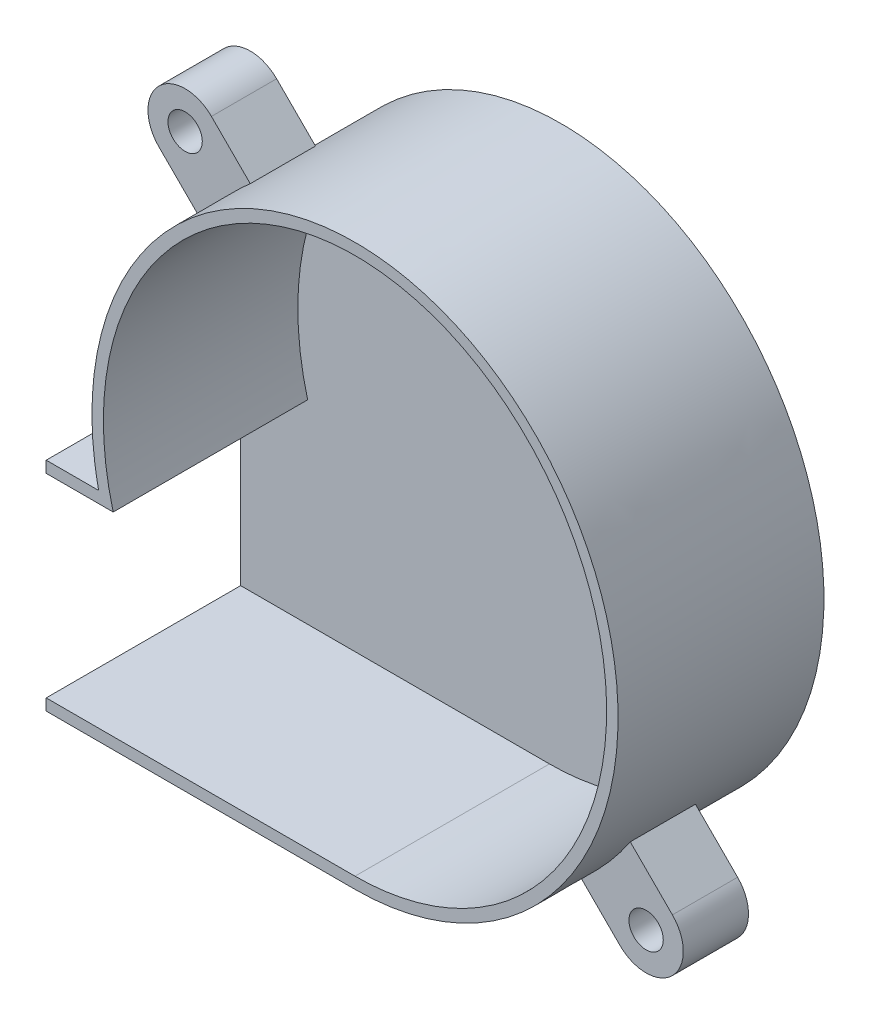
ISO-10303-21;
HEADER;
FILE_DESCRIPTION(('STEP AP214'),'2;1');
FILE_NAME('part.step','',(''),(''),'','','');
FILE_SCHEMA(('AUTOMOTIVE_DESIGN { 1 0 10303 214 1 1 1 1 }'));
ENDSEC;
DATA;
#1=APPLICATION_CONTEXT('core data for automotive mechanical design processes');
#2=APPLICATION_PROTOCOL_DEFINITION('international standard','automotive_design',2000,#1);
#3=PRODUCT_CONTEXT('',#1,'mechanical');
#4=PRODUCT('Part','Part','',(#3));
#5=PRODUCT_RELATED_PRODUCT_CATEGORY('part','',(#4));
#6=PRODUCT_DEFINITION_FORMATION('','',#4);
#7=PRODUCT_DEFINITION_CONTEXT('part definition',#1,'design');
#8=PRODUCT_DEFINITION('design','',#6,#7);
#9=PRODUCT_DEFINITION_SHAPE('','',#8);
#10=(LENGTH_UNIT() NAMED_UNIT(*) SI_UNIT(.MILLI.,.METRE.));
#11=(NAMED_UNIT(*) PLANE_ANGLE_UNIT() SI_UNIT($,.RADIAN.));
#12=(NAMED_UNIT(*) SI_UNIT($,.STERADIAN.) SOLID_ANGLE_UNIT());
#13=UNCERTAINTY_MEASURE_WITH_UNIT(LENGTH_MEASURE(1.E-05),#10,'distance_accuracy_value','');
#14=(GEOMETRIC_REPRESENTATION_CONTEXT(3) GLOBAL_UNCERTAINTY_ASSIGNED_CONTEXT((#13)) GLOBAL_UNIT_ASSIGNED_CONTEXT((#10,
#11,#12)) REPRESENTATION_CONTEXT('',''));
#15=CARTESIAN_POINT('',(0.,0.,0.));
#16=DIRECTION('',(0.,0.,1.));
#17=DIRECTION('',(1.,0.,0.));
#18=AXIS2_PLACEMENT_3D('',#15,#16,#17);
#19=CARTESIAN_POINT('',(0.,0.,1.));
#20=DIRECTION('',(0.,0.,1.));
#21=DIRECTION('',(0.,1.,0.));
#22=AXIS2_PLACEMENT_3D('',#19,#20,#21);
#23=ELLIPSE('',#22,24.5,23.);
#24=DIRECTION('',(0.,0.,-1.));
#25=VECTOR('',#24,1.);
#26=SURFACE_OF_LINEAR_EXTRUSION('',#23,#25);
#27=CARTESIAN_POINT('',(0.,0.,0.));
#28=DIRECTION('',(0.,0.,1.));
#29=DIRECTION('',(0.,1.,0.));
#30=AXIS2_PLACEMENT_3D('',#27,#28,#29);
#31=ELLIPSE('',#30,24.5,23.);
#32=CARTESIAN_POINT('',(0.,-24.5,0.));
#33=VERTEX_POINT('',#32);
#34=CARTESIAN_POINT('',(-22.4129581130781,-5.5,0.));
#35=VERTEX_POINT('',#34);
#36=EDGE_CURVE('E263',#33,#35,#31,.T.);
#37=ORIENTED_EDGE('',*,*,#36,.T.);
#38=DIRECTION('',(0.,0.,-1.));
#39=VECTOR('',#38,1.);
#40=CARTESIAN_POINT('',(-22.4129581130781,-5.5,1.));
#41=LINE('',#40,#39);
#42=CARTESIAN_POINT('',(-22.4129581130781,-5.5,18.));
#43=VERTEX_POINT('',#42);
#44=EDGE_CURVE('E42',#43,#35,#41,.T.);
#45=ORIENTED_EDGE('',*,*,#44,.F.);
#46=CARTESIAN_POINT('',(0.,0.,18.));
#47=DIRECTION('',(0.,0.,1.));
#48=DIRECTION('',(0.,1.,0.));
#49=AXIS2_PLACEMENT_3D('',#46,#47,#48);
#50=ELLIPSE('',#49,24.5,23.);
#51=CARTESIAN_POINT('',(0.,-24.5,18.));
#52=VERTEX_POINT('',#51);
#53=EDGE_CURVE('E291',#52,#43,#50,.T.);
#54=ORIENTED_EDGE('',*,*,#53,.F.);
#55=DIRECTION('',(0.,0.,-1.));
#56=VECTOR('',#55,1.);
#57=CARTESIAN_POINT('',(0.,-24.5,1.));
#58=LINE('',#57,#56);
#59=EDGE_CURVE('E11',#52,#33,#58,.T.);
#60=ORIENTED_EDGE('',*,*,#59,.T.);
#61=EDGE_LOOP('',(#37,#45,#54,#60));
#62=FACE_BOUND('',#61,.T.);
#63=CARTESIAN_POINT('',(0.,0.,12.7));
#64=DIRECTION('',(0.,0.,-1.));
#65=DIRECTION('',(0.,1.,0.));
#66=AXIS2_PLACEMENT_3D('',#63,#64,#65);
#67=ELLIPSE('',#66,24.5,23.);
#68=CARTESIAN_POINT('',(18.7641912023517,-14.1679971246392,12.7));
#69=VERTEX_POINT('',#68);
#70=CARTESIAN_POINT('',(14.4579938729562,-19.0541879506688,12.7));
#71=VERTEX_POINT('',#70);
#72=EDGE_CURVE('E186',#69,#71,#67,.T.);
#73=ORIENTED_EDGE('',*,*,#72,.F.);
#74=DIRECTION('',(0.,0.,-1.));
#75=VECTOR('',#74,1.);
#76=CARTESIAN_POINT('',(18.7641912023517,-14.1679971246392,12.7));
#77=LINE('',#76,#75);
#78=CARTESIAN_POINT('',(18.7641912023517,-14.1679971246392,7.));
#79=VERTEX_POINT('',#78);
#80=EDGE_CURVE('E205',#69,#79,#77,.T.);
#81=ORIENTED_EDGE('',*,*,#80,.T.);
#82=CARTESIAN_POINT('',(0.,0.,7.));
#83=DIRECTION('',(0.,0.,-1.));
#84=DIRECTION('',(0.,1.,0.));
#85=AXIS2_PLACEMENT_3D('',#82,#83,#84);
#86=ELLIPSE('',#85,24.5,23.);
#87=CARTESIAN_POINT('',(14.4579938729562,-19.0541879506688,7.));
#88=VERTEX_POINT('',#87);
#89=EDGE_CURVE('E197',#79,#88,#86,.T.);
#90=ORIENTED_EDGE('',*,*,#89,.T.);
#91=DIRECTION('',(0.,0.,-1.));
#92=VECTOR('',#91,1.);
#93=CARTESIAN_POINT('',(14.4579938729562,-19.0541879506688,12.7));
#94=LINE('',#93,#92);
#95=EDGE_CURVE('E202',#71,#88,#94,.T.);
#96=ORIENTED_EDGE('',*,*,#95,.F.);
#97=EDGE_LOOP('',(#73,#81,#90,#96));
#98=FACE_BOUND('',#97,.T.);
#99=DIRECTION('',(0.,0.,-1.));
#100=VECTOR('',#99,1.);
#101=CARTESIAN_POINT('',(-18.7641912023517,14.1679971246392,12.7));
#102=LINE('',#101,#100);
#103=CARTESIAN_POINT('',(-18.7641912023517,14.1679971246392,12.7));
#104=VERTEX_POINT('',#103);
#105=CARTESIAN_POINT('',(-18.7641912023517,14.1679971246392,7.));
#106=VERTEX_POINT('',#105);
#107=EDGE_CURVE('E55',#104,#106,#102,.T.);
#108=ORIENTED_EDGE('',*,*,#107,.T.);
#109=CARTESIAN_POINT('',(0.,0.,7.));
#110=DIRECTION('',(0.,0.,-1.));
#111=DIRECTION('',(0.,1.,0.));
#112=AXIS2_PLACEMENT_3D('',#109,#110,#111);
#113=ELLIPSE('',#112,24.5,23.);
#114=CARTESIAN_POINT('',(-14.4579938729562,19.0541879506688,7.));
#115=VERTEX_POINT('',#114);
#116=EDGE_CURVE('E548',#106,#115,#113,.T.);
#117=ORIENTED_EDGE('',*,*,#116,.T.);
#118=DIRECTION('',(0.,0.,-1.));
#119=VECTOR('',#118,1.);
#120=CARTESIAN_POINT('',(-14.4579938729562,19.0541879506688,12.7));
#121=LINE('',#120,#119);
#122=CARTESIAN_POINT('',(-14.4579938729562,19.0541879506688,12.7));
#123=VERTEX_POINT('',#122);
#124=EDGE_CURVE('E172',#123,#115,#121,.T.);
#125=ORIENTED_EDGE('',*,*,#124,.F.);
#126=CARTESIAN_POINT('',(0.,0.,12.7));
#127=DIRECTION('',(0.,0.,-1.));
#128=DIRECTION('',(0.,1.,0.));
#129=AXIS2_PLACEMENT_3D('',#126,#127,#128);
#130=ELLIPSE('',#129,24.5,23.);
#131=EDGE_CURVE('E50',#104,#123,#130,.T.);
#132=ORIENTED_EDGE('',*,*,#131,.F.);
#133=EDGE_LOOP('',(#108,#117,#125,#132));
#134=FACE_BOUND('',#133,.T.);
#135=ADVANCED_FACE('F33',(#62,#98,#134),#26,.F.);
#136=CARTESIAN_POINT('',(0.,0.,1.));
#137=DIRECTION('',(0.,0.,1.));
#138=DIRECTION('',(1.,0.,0.));
#139=AXIS2_PLACEMENT_3D('',#136,#137,#138);
#140=PLANE('',#139);
#141=CARTESIAN_POINT('',(-21.1415560322634,-6.5,1.));
#142=CARTESIAN_POINT('',(-21.7759040850454,-4.14616663162075,1.));
#143=CARTESIAN_POINT('',(-22.3500460661726,0.776913351469055,1.));
#144=CARTESIAN_POINT('',(-21.0411485837453,8.08553426296956,1.));
#145=CARTESIAN_POINT('',(-17.6937405646126,14.6032514803996,1.));
#146=CARTESIAN_POINT('',(-12.6420113209987,19.6989015023427,1.));
#147=CARTESIAN_POINT('',(-6.38255061293039,22.8884215040737,1.));
#148=CARTESIAN_POINT('',(0.481967818505515,23.8764200203381,1.));
#149=CARTESIAN_POINT('',(7.30093031096783,22.5731099930776,1.));
#150=CARTESIAN_POINT('',(13.4271662597007,19.097124392934,1.));
#151=CARTESIAN_POINT('',(18.2691214581346,13.7715197027639,1.));
#152=CARTESIAN_POINT('',(21.3495837922645,7.10381393233231,1.));
#153=CARTESIAN_POINT('',(22.3605885719932,-0.259019098050411,1.));
#154=CARTESIAN_POINT('',(21.2003019493631,-7.59647296507907,1.));
#155=CARTESIAN_POINT('',(17.9857877784713,-14.1907372017755,1.));
#156=CARTESIAN_POINT('',(13.0370136266574,-19.4025638833507,1.));
#157=CARTESIAN_POINT('',(6.84551830863374,-22.7360633797071,1.));
#158=CARTESIAN_POINT('',(2.27634490260257,-23.5,1.));
#159=CARTESIAN_POINT('',(0.,-23.5,1.));
#160=B_SPLINE_CURVE_WITH_KNOTS('',3,(#141,#142,#143,#144,#145,#146,#147,#148,#149,#150,#151,
#152,#153,#154,#155,#156,#157,#158,#159),.UNSPECIFIED.,.F.,.F.,(4,1,1,1,1,1,1,1,1,1,1,1,1,1,1,1,
4),(-3.14159265358979,-2.82959621533012,-2.51759977707045,-2.20560333881077,-1.8936069005511,
-1.58161046229143,-1.26961402403176,-0.957617585772083,-0.64562114751241,-0.333624709252737,
-0.0216282709930642,0.290368167266609,0.602364605526281,0.914361043785954,1.22635748204563,
1.5383539203053,1.85035035856497),.UNSPECIFIED.);
#161=CARTESIAN_POINT('',(0.,-23.5,1.));
#162=VERTEX_POINT('',#161);
#163=CARTESIAN_POINT('',(-21.1415560322634,-6.5,1.));
#164=VERTEX_POINT('',#163);
#165=EDGE_CURVE('E311',#162,#164,#160,.F.);
#166=ORIENTED_EDGE('',*,*,#165,.T.);
#167=DIRECTION('',(-1.,0.,0.));
#168=VECTOR('',#167,1.);
#169=CARTESIAN_POINT('',(0.,-6.49999999999998,1.));
#170=LINE('',#169,#168);
#171=CARTESIAN_POINT('',(-27.,-6.50000000000001,1.));
#172=VERTEX_POINT('',#171);
#173=EDGE_CURVE('E258',#164,#172,#170,.T.);
#174=ORIENTED_EDGE('',*,*,#173,.T.);
#175=DIRECTION('',(0.,1.,0.));
#176=VECTOR('',#175,1.);
#177=CARTESIAN_POINT('',(-27.,-24.5,1.));
#178=LINE('',#177,#176);
#179=CARTESIAN_POINT('',(-27.,-23.5,1.));
#180=VERTEX_POINT('',#179);
#181=EDGE_CURVE('E252',#180,#172,#178,.T.);
#182=ORIENTED_EDGE('',*,*,#181,.F.);
#183=DIRECTION('',(1.,0.,0.));
#184=VECTOR('',#183,1.);
#185=CARTESIAN_POINT('',(0.,-23.5,1.));
#186=LINE('',#185,#184);
#187=EDGE_CURVE('E308',#180,#162,#186,.T.);
#188=ORIENTED_EDGE('',*,*,#187,.T.);
#189=EDGE_LOOP('',(#166,#174,#182,#188));
#190=FACE_BOUND('',#189,.T.);
#191=ADVANCED_FACE('F236',(#190),#140,.T.);
#192=CARTESIAN_POINT('',(0.,-24.5,1.));
#193=DIRECTION('',(0.,-1.,0.));
#194=DIRECTION('',(1.,0.,0.));
#195=AXIS2_PLACEMENT_3D('',#192,#193,#194);
#196=PLANE('',#195);
#197=DIRECTION('',(-1.,0.,0.));
#198=VECTOR('',#197,1.);
#199=CARTESIAN_POINT('',(0.,-24.5,0.));
#200=LINE('',#199,#198);
#201=CARTESIAN_POINT('',(-27.,-24.5,0.));
#202=VERTEX_POINT('',#201);
#203=EDGE_CURVE('E254',#33,#202,#200,.T.);
#204=ORIENTED_EDGE('',*,*,#203,.F.);
#205=ORIENTED_EDGE('',*,*,#59,.F.);
#206=DIRECTION('',(-1.,0.,0.));
#207=VECTOR('',#206,1.);
#208=CARTESIAN_POINT('',(0.,-24.5,18.));
#209=LINE('',#208,#207);
#210=CARTESIAN_POINT('',(-27.,-24.5,18.));
#211=VERTEX_POINT('',#210);
#212=EDGE_CURVE('E295',#52,#211,#209,.T.);
#213=ORIENTED_EDGE('',*,*,#212,.T.);
#214=DIRECTION('',(0.,0.,-1.));
#215=VECTOR('',#214,1.);
#216=CARTESIAN_POINT('',(-27.,-24.5,1.));
#217=LINE('',#216,#215);
#218=EDGE_CURVE('E269',#211,#202,#217,.T.);
#219=ORIENTED_EDGE('',*,*,#218,.T.);
#220=EDGE_LOOP('',(#204,#205,#213,#219));
#221=FACE_BOUND('',#220,.T.);
#222=ADVANCED_FACE('F35',(#221),#196,.T.);
#223=CARTESIAN_POINT('',(-27.,-5.50000000000001,1.));
#224=DIRECTION('',(0.,1.,0.));
#225=DIRECTION('',(-1.,0.,0.));
#226=AXIS2_PLACEMENT_3D('',#223,#224,#225);
#227=PLANE('',#226);
#228=DIRECTION('',(1.,0.,0.));
#229=VECTOR('',#228,1.);
#230=CARTESIAN_POINT('',(-27.,-5.50000000000001,0.));
#231=LINE('',#230,#229);
#232=CARTESIAN_POINT('',(-27.,-5.50000000000001,0.));
#233=VERTEX_POINT('',#232);
#234=EDGE_CURVE('E260',#233,#35,#231,.T.);
#235=ORIENTED_EDGE('',*,*,#234,.F.);
#236=DIRECTION('',(0.,0.,-1.));
#237=VECTOR('',#236,1.);
#238=CARTESIAN_POINT('',(-27.,-5.50000000000001,1.));
#239=LINE('',#238,#237);
#240=CARTESIAN_POINT('',(-27.,-5.50000000000001,18.));
#241=VERTEX_POINT('',#240);
#242=EDGE_CURVE('E266',#241,#233,#239,.T.);
#243=ORIENTED_EDGE('',*,*,#242,.F.);
#244=DIRECTION('',(1.,0.,0.));
#245=VECTOR('',#244,1.);
#246=CARTESIAN_POINT('',(0.,-5.49999999999999,18.));
#247=LINE('',#246,#245);
#248=EDGE_CURVE('E276',#241,#43,#247,.T.);
#249=ORIENTED_EDGE('',*,*,#248,.T.);
#250=ORIENTED_EDGE('',*,*,#44,.T.);
#251=EDGE_LOOP('',(#235,#243,#249,#250));
#252=FACE_BOUND('',#251,.T.);
#253=ADVANCED_FACE('F248',(#252),#227,.T.);
#254=CARTESIAN_POINT('',(-27.,-24.5,1.));
#255=DIRECTION('',(-1.,0.,0.));
#256=DIRECTION('',(0.,0.,1.));
#257=AXIS2_PLACEMENT_3D('',#254,#255,#256);
#258=PLANE('',#257);
#259=DIRECTION('',(0.,0.,-1.));
#260=VECTOR('',#259,1.);
#261=CARTESIAN_POINT('',(-27.,-23.5,18.));
#262=LINE('',#261,#260);
#263=CARTESIAN_POINT('',(-27.,-23.5,18.));
#264=VERTEX_POINT('',#263);
#265=EDGE_CURVE('E300',#264,#180,#262,.T.);
#266=ORIENTED_EDGE('',*,*,#265,.T.);
#267=ORIENTED_EDGE('',*,*,#181,.T.);
#268=DIRECTION('',(0.,0.,-1.));
#269=VECTOR('',#268,1.);
#270=CARTESIAN_POINT('',(-27.,-6.50000000000001,18.));
#271=LINE('',#270,#269);
#272=CARTESIAN_POINT('',(-27.,-6.50000000000001,18.));
#273=VERTEX_POINT('',#272);
#274=EDGE_CURVE('E293',#273,#172,#271,.T.);
#275=ORIENTED_EDGE('',*,*,#274,.F.);
#276=DIRECTION('',(0.,1.,0.));
#277=VECTOR('',#276,1.);
#278=CARTESIAN_POINT('',(-27.,0.,18.));
#279=LINE('',#278,#277);
#280=EDGE_CURVE('E287',#273,#241,#279,.T.);
#281=ORIENTED_EDGE('',*,*,#280,.T.);
#282=ORIENTED_EDGE('',*,*,#242,.T.);
#283=DIRECTION('',(0.,1.,0.));
#284=VECTOR('',#283,1.);
#285=CARTESIAN_POINT('',(-27.,-24.5,0.));
#286=LINE('',#285,#284);
#287=EDGE_CURVE('E257',#202,#233,#286,.T.);
#288=ORIENTED_EDGE('',*,*,#287,.F.);
#289=ORIENTED_EDGE('',*,*,#218,.F.);
#290=EDGE_CURVE('E294',#211,#264,#279,.T.);
#291=ORIENTED_EDGE('',*,*,#290,.T.);
#292=EDGE_LOOP('',(#266,#267,#275,#281,#282,#288,#289,#291));
#293=FACE_BOUND('',#292,.T.);
#294=ADVANCED_FACE('F242',(#293),#258,.T.);
#295=CARTESIAN_POINT('',(0.,0.,0.));
#296=DIRECTION('',(0.,0.,1.));
#297=DIRECTION('',(1.,0.,0.));
#298=AXIS2_PLACEMENT_3D('',#295,#296,#297);
#299=PLANE('',#298);
#300=ORIENTED_EDGE('',*,*,#287,.T.);
#301=ORIENTED_EDGE('',*,*,#234,.T.);
#302=ORIENTED_EDGE('',*,*,#36,.F.);
#303=ORIENTED_EDGE('',*,*,#203,.T.);
#304=EDGE_LOOP('',(#300,#301,#302,#303));
#305=FACE_BOUND('',#304,.T.);
#306=ADVANCED_FACE('F234',(#305),#299,.F.);
#307=CARTESIAN_POINT('',(0.,-6.49999999999998,18.));
#308=DIRECTION('',(0.,1.,0.));
#309=DIRECTION('',(-1.,0.,0.));
#310=AXIS2_PLACEMENT_3D('',#307,#308,#309);
#311=PLANE('',#310);
#312=ORIENTED_EDGE('',*,*,#173,.F.);
#313=DIRECTION('',(0.,0.,-1.));
#314=VECTOR('',#313,1.);
#315=CARTESIAN_POINT('',(-21.1415560322634,-6.5,18.));
#316=LINE('',#315,#314);
#317=CARTESIAN_POINT('',(-21.1415560322634,-6.5,18.));
#318=VERTEX_POINT('',#317);
#319=EDGE_CURVE('E305',#318,#164,#316,.T.);
#320=ORIENTED_EDGE('',*,*,#319,.F.);
#321=DIRECTION('',(1.,0.,0.));
#322=VECTOR('',#321,1.);
#323=CARTESIAN_POINT('',(0.,-6.49999999999998,18.));
#324=LINE('',#323,#322);
#325=EDGE_CURVE('E210',#273,#318,#324,.T.);
#326=ORIENTED_EDGE('',*,*,#325,.F.);
#327=ORIENTED_EDGE('',*,*,#274,.T.);
#328=EDGE_LOOP('',(#312,#320,#326,#327));
#329=FACE_BOUND('',#328,.T.);
#330=ADVANCED_FACE('F229',(#329),#311,.F.);
#331=CARTESIAN_POINT('',(-21.1415560322634,-6.5,18.));
#332=CARTESIAN_POINT('',(-21.7759040850454,-4.14616663162075,18.));
#333=CARTESIAN_POINT('',(-22.3500460661726,0.776913351469055,18.));
#334=CARTESIAN_POINT('',(-21.0411485837453,8.08553426296956,18.));
#335=CARTESIAN_POINT('',(-17.6937405646126,14.6032514803996,18.));
#336=CARTESIAN_POINT('',(-12.6420113209987,19.6989015023427,18.));
#337=CARTESIAN_POINT('',(-6.38255061293039,22.8884215040737,18.));
#338=CARTESIAN_POINT('',(0.481967818505515,23.8764200203381,18.));
#339=CARTESIAN_POINT('',(7.30093031096783,22.5731099930776,18.));
#340=CARTESIAN_POINT('',(13.4271662597007,19.097124392934,18.));
#341=CARTESIAN_POINT('',(18.2691214581346,13.7715197027639,18.));
#342=CARTESIAN_POINT('',(21.3495837922645,7.10381393233231,18.));
#343=CARTESIAN_POINT('',(22.3605885719932,-0.259019098050411,18.));
#344=CARTESIAN_POINT('',(21.2003019493631,-7.59647296507907,18.));
#345=CARTESIAN_POINT('',(17.9857877784713,-14.1907372017755,18.));
#346=CARTESIAN_POINT('',(13.0370136266574,-19.4025638833507,18.));
#347=CARTESIAN_POINT('',(6.84551830863374,-22.7360633797071,18.));
#348=CARTESIAN_POINT('',(2.27634490260257,-23.5,18.));
#349=CARTESIAN_POINT('',(0.,-23.5,18.));
#350=B_SPLINE_CURVE_WITH_KNOTS('',3,(#331,#332,#333,#334,#335,#336,#337,#338,#339,#340,#341,
#342,#343,#344,#345,#346,#347,#348,#349),.UNSPECIFIED.,.F.,.F.,(4,1,1,1,1,1,1,1,1,1,1,1,1,1,1,1,
4),(-3.14159265358979,-2.82959621533012,-2.51759977707045,-2.20560333881077,-1.8936069005511,
-1.58161046229143,-1.26961402403176,-0.957617585772083,-0.64562114751241,-0.333624709252737,
-0.0216282709930642,0.290368167266609,0.602364605526281,0.914361043785954,1.22635748204563,
1.5383539203053,1.85035035856497),.UNSPECIFIED.);
#351=DIRECTION('',(0.,0.,-1.));
#352=VECTOR('',#351,1.);
#353=SURFACE_OF_LINEAR_EXTRUSION('',#350,#352);
#354=ORIENTED_EDGE('',*,*,#165,.F.);
#355=DIRECTION('',(0.,0.,-1.));
#356=VECTOR('',#355,1.);
#357=CARTESIAN_POINT('',(0.,-23.5,18.));
#358=LINE('',#357,#356);
#359=CARTESIAN_POINT('',(0.,-23.5,18.));
#360=VERTEX_POINT('',#359);
#361=EDGE_CURVE('E302',#360,#162,#358,.T.);
#362=ORIENTED_EDGE('',*,*,#361,.F.);
#363=EDGE_CURVE('E213',#318,#360,#350,.T.);
#364=ORIENTED_EDGE('',*,*,#363,.F.);
#365=ORIENTED_EDGE('',*,*,#319,.T.);
#366=EDGE_LOOP('',(#354,#362,#364,#365));
#367=FACE_BOUND('',#366,.T.);
#368=ADVANCED_FACE('F224',(#367),#353,.F.);
#369=CARTESIAN_POINT('',(0.,-23.5,18.));
#370=DIRECTION('',(0.,-1.,0.));
#371=DIRECTION('',(0.,0.,-1.));
#372=AXIS2_PLACEMENT_3D('',#369,#370,#371);
#373=PLANE('',#372);
#374=ORIENTED_EDGE('',*,*,#187,.F.);
#375=ORIENTED_EDGE('',*,*,#265,.F.);
#376=DIRECTION('',(-1.,0.,0.));
#377=VECTOR('',#376,1.);
#378=CARTESIAN_POINT('',(0.,-23.5,18.));
#379=LINE('',#378,#377);
#380=EDGE_CURVE('E218',#360,#264,#379,.T.);
#381=ORIENTED_EDGE('',*,*,#380,.F.);
#382=ORIENTED_EDGE('',*,*,#361,.T.);
#383=EDGE_LOOP('',(#374,#375,#381,#382));
#384=FACE_BOUND('',#383,.T.);
#385=ADVANCED_FACE('F228',(#384),#373,.F.);
#386=CARTESIAN_POINT('',(0.,0.,18.));
#387=DIRECTION('',(0.,0.,1.));
#388=DIRECTION('',(1.,0.,0.));
#389=AXIS2_PLACEMENT_3D('',#386,#387,#388);
#390=PLANE('',#389);
#391=ORIENTED_EDGE('',*,*,#325,.T.);
#392=ORIENTED_EDGE('',*,*,#363,.T.);
#393=ORIENTED_EDGE('',*,*,#380,.T.);
#394=ORIENTED_EDGE('',*,*,#290,.F.);
#395=ORIENTED_EDGE('',*,*,#212,.F.);
#396=ORIENTED_EDGE('',*,*,#53,.T.);
#397=ORIENTED_EDGE('',*,*,#248,.F.);
#398=ORIENTED_EDGE('',*,*,#280,.F.);
#399=EDGE_LOOP('',(#391,#392,#393,#394,#395,#396,#397,#398));
#400=FACE_BOUND('',#399,.T.);
#401=ADVANCED_FACE('F289',(#400),#390,.T.);
#402=CARTESIAN_POINT('',(0.,0.,12.7));
#403=DIRECTION('',(0.,0.,1.));
#404=DIRECTION('',(1.,0.,0.));
#405=AXIS2_PLACEMENT_3D('',#402,#403,#404);
#406=PLANE('',#405);
#407=CARTESIAN_POINT('',(20.1525432638166,-20.1525432638166,12.7));
#408=DIRECTION('',(0.,0.,1.));
#409=DIRECTION('',(1.,0.,0.));
#410=AXIS2_PLACEMENT_3D('',#407,#408,#409);
#411=CIRCLE('',#410,3.25);
#412=CARTESIAN_POINT('',(17.8544462249603,-22.4506403026729,12.7));
#413=VERTEX_POINT('',#412);
#414=CARTESIAN_POINT('',(22.4506403026729,-17.8544462249603,12.7));
#415=VERTEX_POINT('',#414);
#416=EDGE_CURVE('E179',#413,#415,#411,.T.);
#417=ORIENTED_EDGE('',*,*,#416,.T.);
#418=DIRECTION('',(-0.707106781186547,0.707106781186549,0.));
#419=VECTOR('',#418,1.);
#420=CARTESIAN_POINT('',(22.4506403026729,-17.8544462249603,12.7));
#421=LINE('',#420,#419);
#422=EDGE_CURVE('E182',#415,#69,#421,.T.);
#423=ORIENTED_EDGE('',*,*,#422,.T.);
#424=ORIENTED_EDGE('',*,*,#72,.T.);
#425=DIRECTION('',(0.707106781186546,-0.707106781186549,0.));
#426=VECTOR('',#425,1.);
#427=CARTESIAN_POINT('',(17.8544462249603,-22.4506403026729,12.7));
#428=LINE('',#427,#426);
#429=EDGE_CURVE('E189',#71,#413,#428,.T.);
#430=ORIENTED_EDGE('',*,*,#429,.T.);
#431=EDGE_LOOP('',(#417,#423,#424,#430));
#432=FACE_BOUND('',#431,.T.);
#433=CARTESIAN_POINT('',(20.1525432638166,-20.1525432638166,12.7));
#434=DIRECTION('',(0.,0.,1.));
#435=DIRECTION('',(1.,0.,0.));
#436=AXIS2_PLACEMENT_3D('',#433,#434,#435);
#437=CIRCLE('',#436,1.5);
#438=CARTESIAN_POINT('',(21.6525432638166,-20.1525432638166,12.7));
#439=VERTEX_POINT('',#438);
#440=EDGE_CURVE('E170',#439,#439,#437,.T.);
#441=ORIENTED_EDGE('',*,*,#440,.F.);
#442=EDGE_LOOP('',(#441));
#443=FACE_BOUND('',#442,.T.);
#444=ADVANCED_FACE('F363',(#432,#443),#406,.T.);
#445=CARTESIAN_POINT('',(0.,0.,7.));
#446=DIRECTION('',(0.,0.,1.));
#447=DIRECTION('',(1.,0.,0.));
#448=AXIS2_PLACEMENT_3D('',#445,#446,#447);
#449=PLANE('',#448);
#450=CARTESIAN_POINT('',(20.1525432638166,-20.1525432638166,7.));
#451=DIRECTION('',(0.,0.,1.));
#452=DIRECTION('',(1.,0.,0.));
#453=AXIS2_PLACEMENT_3D('',#450,#451,#452);
#454=CIRCLE('',#453,3.25);
#455=CARTESIAN_POINT('',(17.8544462249603,-22.4506403026729,7.));
#456=VERTEX_POINT('',#455);
#457=CARTESIAN_POINT('',(22.4506403026729,-17.8544462249603,7.));
#458=VERTEX_POINT('',#457);
#459=EDGE_CURVE('E177',#456,#458,#454,.T.);
#460=ORIENTED_EDGE('',*,*,#459,.F.);
#461=DIRECTION('',(0.707106781186546,-0.707106781186549,0.));
#462=VECTOR('',#461,1.);
#463=CARTESIAN_POINT('',(17.8544462249603,-22.4506403026729,7.));
#464=LINE('',#463,#462);
#465=EDGE_CURVE('E183',#88,#456,#464,.T.);
#466=ORIENTED_EDGE('',*,*,#465,.F.);
#467=ORIENTED_EDGE('',*,*,#89,.F.);
#468=DIRECTION('',(-0.707106781186547,0.707106781186549,0.));
#469=VECTOR('',#468,1.);
#470=CARTESIAN_POINT('',(22.4506403026729,-17.8544462249603,7.));
#471=LINE('',#470,#469);
#472=EDGE_CURVE('E194',#458,#79,#471,.T.);
#473=ORIENTED_EDGE('',*,*,#472,.F.);
#474=EDGE_LOOP('',(#460,#466,#467,#473));
#475=FACE_BOUND('',#474,.T.);
#476=CARTESIAN_POINT('',(20.1525432638166,-20.1525432638166,7.));
#477=DIRECTION('',(0.,0.,1.));
#478=DIRECTION('',(1.,0.,0.));
#479=AXIS2_PLACEMENT_3D('',#476,#477,#478);
#480=CIRCLE('',#479,1.5);
#481=CARTESIAN_POINT('',(21.6525432638166,-20.1525432638166,7.));
#482=VERTEX_POINT('',#481);
#483=EDGE_CURVE('E167',#482,#482,#480,.T.);
#484=ORIENTED_EDGE('',*,*,#483,.T.);
#485=EDGE_LOOP('',(#484));
#486=FACE_BOUND('',#485,.T.);
#487=ADVANCED_FACE('F370',(#475,#486),#449,.F.);
#488=CARTESIAN_POINT('',(20.1525432638166,-20.1525432638166,12.7));
#489=DIRECTION('',(0.,0.,-1.));
#490=DIRECTION('',(-1.,0.,0.));
#491=AXIS2_PLACEMENT_3D('',#488,#489,#490);
#492=CYLINDRICAL_SURFACE('',#491,3.25);
#493=ORIENTED_EDGE('',*,*,#459,.T.);
#494=DIRECTION('',(0.,0.,-1.));
#495=VECTOR('',#494,1.);
#496=CARTESIAN_POINT('',(22.4506403026729,-17.8544462249603,12.7));
#497=LINE('',#496,#495);
#498=EDGE_CURVE('E207',#415,#458,#497,.T.);
#499=ORIENTED_EDGE('',*,*,#498,.F.);
#500=ORIENTED_EDGE('',*,*,#416,.F.);
#501=DIRECTION('',(0.,0.,-1.));
#502=VECTOR('',#501,1.);
#503=CARTESIAN_POINT('',(17.8544462249603,-22.4506403026729,12.7));
#504=LINE('',#503,#502);
#505=EDGE_CURVE('E191',#413,#456,#504,.T.);
#506=ORIENTED_EDGE('',*,*,#505,.T.);
#507=EDGE_LOOP('',(#493,#499,#500,#506));
#508=FACE_BOUND('',#507,.T.);
#509=ADVANCED_FACE('F378',(#508),#492,.T.);
#510=CARTESIAN_POINT('',(22.4506403026729,-17.8544462249603,12.7));
#511=DIRECTION('',(-0.707106781186548,-0.707106781186546,0.));
#512=DIRECTION('',(0.707106781186547,-0.707106781186549,0.));
#513=AXIS2_PLACEMENT_3D('',#510,#511,#512);
#514=PLANE('',#513);
#515=ORIENTED_EDGE('',*,*,#472,.T.);
#516=ORIENTED_EDGE('',*,*,#80,.F.);
#517=ORIENTED_EDGE('',*,*,#422,.F.);
#518=ORIENTED_EDGE('',*,*,#498,.T.);
#519=EDGE_LOOP('',(#515,#516,#517,#518));
#520=FACE_BOUND('',#519,.T.);
#521=ADVANCED_FACE('F386',(#520),#514,.F.);
#522=CARTESIAN_POINT('',(17.8544462249603,-22.4506403026729,12.7));
#523=DIRECTION('',(0.707106781186548,0.707106781186546,0.));
#524=DIRECTION('',(-0.707106781186546,0.707106781186549,0.));
#525=AXIS2_PLACEMENT_3D('',#522,#523,#524);
#526=PLANE('',#525);
#527=ORIENTED_EDGE('',*,*,#465,.T.);
#528=ORIENTED_EDGE('',*,*,#505,.F.);
#529=ORIENTED_EDGE('',*,*,#429,.F.);
#530=ORIENTED_EDGE('',*,*,#95,.T.);
#531=EDGE_LOOP('',(#527,#528,#529,#530));
#532=FACE_BOUND('',#531,.T.);
#533=ADVANCED_FACE('F394',(#532),#526,.F.);
#534=CARTESIAN_POINT('',(20.1525432638166,-20.1525432638166,12.7));
#535=DIRECTION('',(0.,0.,-1.));
#536=DIRECTION('',(-1.,0.,0.));
#537=AXIS2_PLACEMENT_3D('',#534,#535,#536);
#538=CYLINDRICAL_SURFACE('',#537,1.5);
#539=ORIENTED_EDGE('',*,*,#440,.T.);
#540=EDGE_LOOP('',(#539));
#541=FACE_BOUND('',#540,.T.);
#542=ORIENTED_EDGE('',*,*,#483,.F.);
#543=EDGE_LOOP('',(#542));
#544=FACE_BOUND('',#543,.T.);
#545=ADVANCED_FACE('F402',(#541,#544),#538,.F.);
#546=CARTESIAN_POINT('',(0.,0.,12.7));
#547=DIRECTION('',(0.,0.,1.));
#548=DIRECTION('',(1.,0.,0.));
#549=AXIS2_PLACEMENT_3D('',#546,#547,#548);
#550=PLANE('',#549);
#551=CARTESIAN_POINT('',(-20.1525432638166,20.1525432638166,12.7));
#552=DIRECTION('',(0.,0.,1.));
#553=DIRECTION('',(1.,0.,0.));
#554=AXIS2_PLACEMENT_3D('',#551,#552,#553);
#555=CIRCLE('',#554,3.24999999999999);
#556=CARTESIAN_POINT('',(-17.8544462249603,22.4506403026729,12.7));
#557=VERTEX_POINT('',#556);
#558=CARTESIAN_POINT('',(-22.4506403026728,17.8544462249604,12.7));
#559=VERTEX_POINT('',#558);
#560=EDGE_CURVE('E152',#557,#559,#555,.T.);
#561=ORIENTED_EDGE('',*,*,#560,.T.);
#562=DIRECTION('',(0.707106781186547,-0.707106781186548,0.));
#563=VECTOR('',#562,1.);
#564=CARTESIAN_POINT('',(-18.7641912023517,14.1679971246392,12.7));
#565=LINE('',#564,#563);
#566=EDGE_CURVE('E145',#559,#104,#565,.T.);
#567=ORIENTED_EDGE('',*,*,#566,.T.);
#568=ORIENTED_EDGE('',*,*,#131,.T.);
#569=DIRECTION('',(-0.707106781186546,0.707106781186549,0.));
#570=VECTOR('',#569,1.);
#571=CARTESIAN_POINT('',(-14.4579938729562,19.0541879506688,12.7));
#572=LINE('',#571,#570);
#573=EDGE_CURVE('E158',#123,#557,#572,.T.);
#574=ORIENTED_EDGE('',*,*,#573,.T.);
#575=EDGE_LOOP('',(#561,#567,#568,#574));
#576=FACE_BOUND('',#575,.T.);
#577=CARTESIAN_POINT('',(-20.1525432638166,20.1525432638166,12.7));
#578=DIRECTION('',(0.,0.,1.));
#579=DIRECTION('',(1.,0.,0.));
#580=AXIS2_PLACEMENT_3D('',#577,#578,#579);
#581=CIRCLE('',#580,1.5);
#582=CARTESIAN_POINT('',(-18.6525432638166,20.1525432638166,12.7));
#583=VERTEX_POINT('',#582);
#584=EDGE_CURVE('E534',#583,#583,#581,.T.);
#585=ORIENTED_EDGE('',*,*,#584,.F.);
#586=EDGE_LOOP('',(#585));
#587=FACE_BOUND('',#586,.T.);
#588=ADVANCED_FACE('F155',(#576,#587),#550,.T.);
#589=CARTESIAN_POINT('',(0.,0.,7.));
#590=DIRECTION('',(0.,0.,1.));
#591=DIRECTION('',(1.,0.,0.));
#592=AXIS2_PLACEMENT_3D('',#589,#590,#591);
#593=PLANE('',#592);
#594=CARTESIAN_POINT('',(-20.1525432638166,20.1525432638166,7.));
#595=DIRECTION('',(0.,0.,1.));
#596=DIRECTION('',(1.,0.,0.));
#597=AXIS2_PLACEMENT_3D('',#594,#595,#596);
#598=CIRCLE('',#597,3.24999999999999);
#599=CARTESIAN_POINT('',(-17.8544462249603,22.4506403026729,7.));
#600=VERTEX_POINT('',#599);
#601=CARTESIAN_POINT('',(-22.4506403026728,17.8544462249604,7.));
#602=VERTEX_POINT('',#601);
#603=EDGE_CURVE('E166',#600,#602,#598,.T.);
#604=ORIENTED_EDGE('',*,*,#603,.F.);
#605=DIRECTION('',(-0.707106781186546,0.707106781186549,0.));
#606=VECTOR('',#605,1.);
#607=CARTESIAN_POINT('',(-14.4579938729562,19.0541879506688,7.));
#608=LINE('',#607,#606);
#609=EDGE_CURVE('E162',#115,#600,#608,.T.);
#610=ORIENTED_EDGE('',*,*,#609,.F.);
#611=ORIENTED_EDGE('',*,*,#116,.F.);
#612=DIRECTION('',(0.707106781186547,-0.707106781186548,0.));
#613=VECTOR('',#612,1.);
#614=CARTESIAN_POINT('',(-18.7641912023517,14.1679971246392,7.));
#615=LINE('',#614,#613);
#616=EDGE_CURVE('E546',#602,#106,#615,.T.);
#617=ORIENTED_EDGE('',*,*,#616,.F.);
#618=EDGE_LOOP('',(#604,#610,#611,#617));
#619=FACE_BOUND('',#618,.T.);
#620=CARTESIAN_POINT('',(-20.1525432638166,20.1525432638166,7.));
#621=DIRECTION('',(0.,0.,1.));
#622=DIRECTION('',(1.,0.,0.));
#623=AXIS2_PLACEMENT_3D('',#620,#621,#622);
#624=CIRCLE('',#623,1.5);
#625=CARTESIAN_POINT('',(-18.6525432638166,20.1525432638166,7.));
#626=VERTEX_POINT('',#625);
#627=EDGE_CURVE('E537',#626,#626,#624,.T.);
#628=ORIENTED_EDGE('',*,*,#627,.T.);
#629=EDGE_LOOP('',(#628));
#630=FACE_BOUND('',#629,.T.);
#631=ADVANCED_FACE('F417',(#619,#630),#593,.F.);
#632=CARTESIAN_POINT('',(-20.1525432638166,20.1525432638166,12.7));
#633=DIRECTION('',(0.,0.,-1.));
#634=DIRECTION('',(-1.,0.,0.));
#635=AXIS2_PLACEMENT_3D('',#632,#633,#634);
#636=CYLINDRICAL_SURFACE('',#635,3.24999999999999);
#637=ORIENTED_EDGE('',*,*,#603,.T.);
#638=DIRECTION('',(0.,0.,-1.));
#639=VECTOR('',#638,1.);
#640=CARTESIAN_POINT('',(-22.4506403026728,17.8544462249604,12.7));
#641=LINE('',#640,#639);
#642=EDGE_CURVE('E149',#559,#602,#641,.T.);
#643=ORIENTED_EDGE('',*,*,#642,.F.);
#644=ORIENTED_EDGE('',*,*,#560,.F.);
#645=DIRECTION('',(0.,0.,-1.));
#646=VECTOR('',#645,1.);
#647=CARTESIAN_POINT('',(-17.8544462249603,22.4506403026729,12.7));
#648=LINE('',#647,#646);
#649=EDGE_CURVE('E544',#557,#600,#648,.T.);
#650=ORIENTED_EDGE('',*,*,#649,.T.);
#651=EDGE_LOOP('',(#637,#643,#644,#650));
#652=FACE_BOUND('',#651,.T.);
#653=ADVANCED_FACE('F164',(#652),#636,.T.);
#654=CARTESIAN_POINT('',(-18.7641912023517,14.1679971246392,12.7));
#655=DIRECTION('',(0.707106781186548,0.707106781186547,0.));
#656=DIRECTION('',(-0.707106781186547,0.707106781186548,0.));
#657=AXIS2_PLACEMENT_3D('',#654,#655,#656);
#658=PLANE('',#657);
#659=ORIENTED_EDGE('',*,*,#616,.T.);
#660=ORIENTED_EDGE('',*,*,#107,.F.);
#661=ORIENTED_EDGE('',*,*,#566,.F.);
#662=ORIENTED_EDGE('',*,*,#642,.T.);
#663=EDGE_LOOP('',(#659,#660,#661,#662));
#664=FACE_BOUND('',#663,.T.);
#665=ADVANCED_FACE('F147',(#664),#658,.F.);
#666=CARTESIAN_POINT('',(-14.4579938729562,19.0541879506688,12.7));
#667=DIRECTION('',(-0.707106781186548,-0.707106781186546,0.));
#668=DIRECTION('',(0.707106781186546,-0.707106781186549,0.));
#669=AXIS2_PLACEMENT_3D('',#666,#667,#668);
#670=PLANE('',#669);
#671=ORIENTED_EDGE('',*,*,#609,.T.);
#672=ORIENTED_EDGE('',*,*,#649,.F.);
#673=ORIENTED_EDGE('',*,*,#573,.F.);
#674=ORIENTED_EDGE('',*,*,#124,.T.);
#675=EDGE_LOOP('',(#671,#672,#673,#674));
#676=FACE_BOUND('',#675,.T.);
#677=ADVANCED_FACE('F437',(#676),#670,.F.);
#678=CARTESIAN_POINT('',(-20.1525432638166,20.1525432638166,12.7));
#679=DIRECTION('',(0.,0.,-1.));
#680=DIRECTION('',(-1.,0.,0.));
#681=AXIS2_PLACEMENT_3D('',#678,#679,#680);
#682=CYLINDRICAL_SURFACE('',#681,1.5);
#683=ORIENTED_EDGE('',*,*,#584,.T.);
#684=EDGE_LOOP('',(#683));
#685=FACE_BOUND('',#684,.T.);
#686=ORIENTED_EDGE('',*,*,#627,.F.);
#687=EDGE_LOOP('',(#686));
#688=FACE_BOUND('',#687,.T.);
#689=ADVANCED_FACE('F444',(#685,#688),#682,.F.);
#690=CLOSED_SHELL('',(#135,#191,#222,#253,#294,#306,#330,#368,#385,#401,#444,#487,#509,#521,
#533,#545,#588,#631,#653,#665,#677,#689));
#691=MANIFOLD_SOLID_BREP('B2',#690);
#692=ADVANCED_BREP_SHAPE_REPRESENTATION('',(#18,#691),#14);
#693=SHAPE_DEFINITION_REPRESENTATION(#9,#692);
ENDSEC;
END-ISO-10303-21;
